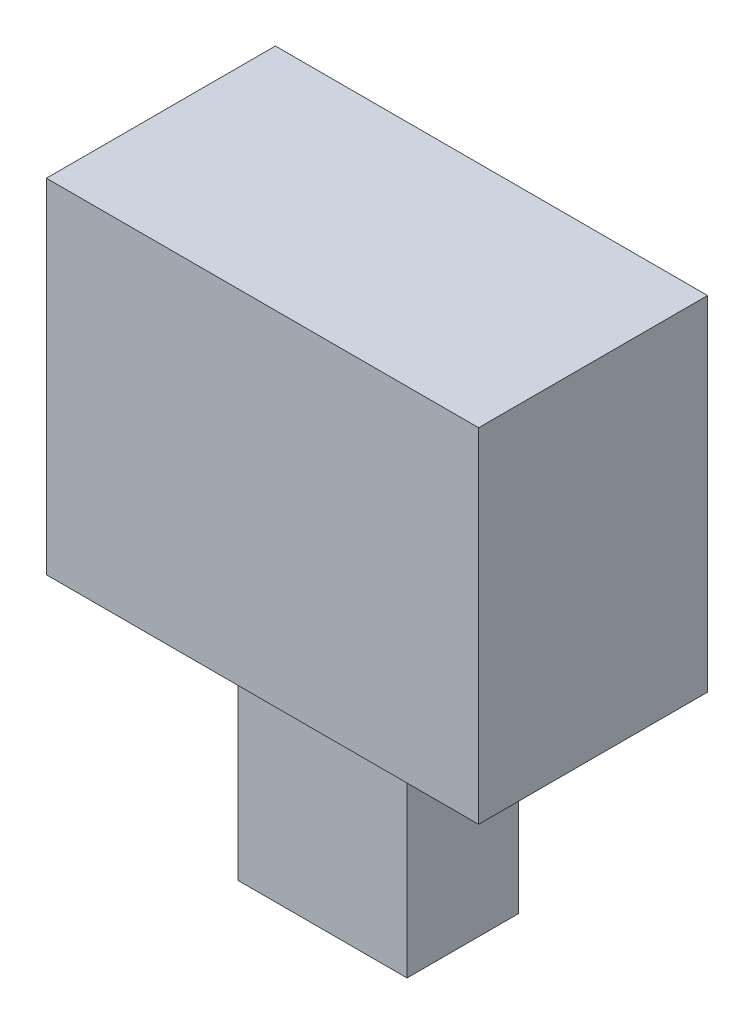
ISO-10303-21;
HEADER;
FILE_DESCRIPTION(('STEP AP214'),'2;1');
FILE_NAME('part.step','',(''),(''),'','','');
FILE_SCHEMA(('AUTOMOTIVE_DESIGN { 1 0 10303 214 1 1 1 1 }'));
ENDSEC;
DATA;
#1=APPLICATION_CONTEXT('core data for automotive mechanical design processes');
#2=APPLICATION_PROTOCOL_DEFINITION('international standard','automotive_design',2000,#1);
#3=PRODUCT_CONTEXT('',#1,'mechanical');
#4=PRODUCT('Part','Part','',(#3));
#5=PRODUCT_RELATED_PRODUCT_CATEGORY('part','',(#4));
#6=PRODUCT_DEFINITION_FORMATION('','',#4);
#7=PRODUCT_DEFINITION_CONTEXT('part definition',#1,'design');
#8=PRODUCT_DEFINITION('design','',#6,#7);
#9=PRODUCT_DEFINITION_SHAPE('','',#8);
#10=(LENGTH_UNIT() NAMED_UNIT(*) SI_UNIT(.MILLI.,.METRE.));
#11=(NAMED_UNIT(*) PLANE_ANGLE_UNIT() SI_UNIT($,.RADIAN.));
#12=(NAMED_UNIT(*) SI_UNIT($,.STERADIAN.) SOLID_ANGLE_UNIT());
#13=UNCERTAINTY_MEASURE_WITH_UNIT(LENGTH_MEASURE(1.E-05),#10,'distance_accuracy_value','');
#14=(GEOMETRIC_REPRESENTATION_CONTEXT(3) GLOBAL_UNCERTAINTY_ASSIGNED_CONTEXT((#13)) GLOBAL_UNIT_ASSIGNED_CONTEXT((#10,
#11,#12)) REPRESENTATION_CONTEXT('',''));
#15=CARTESIAN_POINT('',(0.,0.,0.));
#16=DIRECTION('',(0.,0.,1.));
#17=DIRECTION('',(1.,0.,0.));
#18=AXIS2_PLACEMENT_3D('',#15,#16,#17);
#19=CARTESIAN_POINT('',(-7.375,50.,5.));
#20=DIRECTION('',(0.,0.,-1.));
#21=DIRECTION('',(-1.,0.,0.));
#22=AXIS2_PLACEMENT_3D('',#19,#20,#21);
#23=PLANE('',#22);
#24=DIRECTION('',(1.,0.,0.));
#25=VECTOR('',#24,1.);
#26=CARTESIAN_POINT('',(-7.375,20.,5.));
#27=LINE('',#26,#25);
#28=CARTESIAN_POINT('',(-7.375,20.,5.));
#29=VERTEX_POINT('',#28);
#30=CARTESIAN_POINT('',(7.375,20.,5.));
#31=VERTEX_POINT('',#30);
#32=EDGE_CURVE('E169',#29,#31,#27,.T.);
#33=ORIENTED_EDGE('',*,*,#32,.F.);
#34=DIRECTION('',(0.,-1.,0.));
#35=VECTOR('',#34,1.);
#36=CARTESIAN_POINT('',(-7.375,50.,5.));
#37=LINE('',#36,#35);
#38=CARTESIAN_POINT('',(-7.375,0.,5.));
#39=VERTEX_POINT('',#38);
#40=EDGE_CURVE('E189',#29,#39,#37,.T.);
#41=ORIENTED_EDGE('',*,*,#40,.T.);
#42=DIRECTION('',(1.,0.,0.));
#43=VECTOR('',#42,1.);
#44=CARTESIAN_POINT('',(-7.375,0.,5.));
#45=LINE('',#44,#43);
#46=CARTESIAN_POINT('',(7.375,0.,5.));
#47=VERTEX_POINT('',#46);
#48=EDGE_CURVE('E173',#39,#47,#45,.T.);
#49=ORIENTED_EDGE('',*,*,#48,.T.);
#50=DIRECTION('',(0.,-1.,0.));
#51=VECTOR('',#50,1.);
#52=CARTESIAN_POINT('',(7.375,50.,5.));
#53=LINE('',#52,#51);
#54=EDGE_CURVE('E53',#31,#47,#53,.T.);
#55=ORIENTED_EDGE('',*,*,#54,.F.);
#56=EDGE_LOOP('',(#33,#41,#49,#55));
#57=FACE_BOUND('',#56,.T.);
#58=ADVANCED_FACE('F45',(#57),#23,.F.);
#59=CARTESIAN_POINT('',(7.375,50.,5.));
#60=DIRECTION('',(-1.,0.,0.));
#61=DIRECTION('',(0.,0.,1.));
#62=AXIS2_PLACEMENT_3D('',#59,#60,#61);
#63=PLANE('',#62);
#64=DIRECTION('',(0.,0.,-1.));
#65=VECTOR('',#64,1.);
#66=CARTESIAN_POINT('',(7.375,20.,5.));
#67=LINE('',#66,#65);
#68=CARTESIAN_POINT('',(7.375,20.,-4.75));
#69=VERTEX_POINT('',#68);
#70=EDGE_CURVE('E60',#31,#69,#67,.T.);
#71=ORIENTED_EDGE('',*,*,#70,.F.);
#72=ORIENTED_EDGE('',*,*,#54,.T.);
#73=DIRECTION('',(0.,0.,-1.));
#74=VECTOR('',#73,1.);
#75=CARTESIAN_POINT('',(7.375,0.,5.));
#76=LINE('',#75,#74);
#77=CARTESIAN_POINT('',(7.375,0.,-4.75));
#78=VERTEX_POINT('',#77);
#79=EDGE_CURVE('E177',#47,#78,#76,.T.);
#80=ORIENTED_EDGE('',*,*,#79,.T.);
#81=DIRECTION('',(0.,-1.,0.));
#82=VECTOR('',#81,1.);
#83=CARTESIAN_POINT('',(7.375,50.,-4.75));
#84=LINE('',#83,#82);
#85=EDGE_CURVE('E195',#69,#78,#84,.T.);
#86=ORIENTED_EDGE('',*,*,#85,.F.);
#87=EDGE_LOOP('',(#71,#72,#80,#86));
#88=FACE_BOUND('',#87,.T.);
#89=ADVANCED_FACE('F199',(#88),#63,.F.);
#90=CARTESIAN_POINT('',(7.375,50.,-4.75));
#91=DIRECTION('',(0.,0.,1.));
#92=DIRECTION('',(1.,0.,0.));
#93=AXIS2_PLACEMENT_3D('',#90,#91,#92);
#94=PLANE('',#93);
#95=DIRECTION('',(-1.,0.,0.));
#96=VECTOR('',#95,1.);
#97=CARTESIAN_POINT('',(7.375,20.,-4.75));
#98=LINE('',#97,#96);
#99=CARTESIAN_POINT('',(-7.375,20.,-4.75));
#100=VERTEX_POINT('',#99);
#101=EDGE_CURVE('E68',#69,#100,#98,.T.);
#102=ORIENTED_EDGE('',*,*,#101,.F.);
#103=ORIENTED_EDGE('',*,*,#85,.T.);
#104=DIRECTION('',(-1.,0.,0.));
#105=VECTOR('',#104,1.);
#106=CARTESIAN_POINT('',(7.375,0.,-4.75));
#107=LINE('',#106,#105);
#108=CARTESIAN_POINT('',(-7.375,0.,-4.75));
#109=VERTEX_POINT('',#108);
#110=EDGE_CURVE('E181',#78,#109,#107,.T.);
#111=ORIENTED_EDGE('',*,*,#110,.T.);
#112=DIRECTION('',(0.,-1.,0.));
#113=VECTOR('',#112,1.);
#114=CARTESIAN_POINT('',(-7.375,50.,-4.75));
#115=LINE('',#114,#113);
#116=EDGE_CURVE('E192',#100,#109,#115,.T.);
#117=ORIENTED_EDGE('',*,*,#116,.F.);
#118=EDGE_LOOP('',(#102,#103,#111,#117));
#119=FACE_BOUND('',#118,.T.);
#120=ADVANCED_FACE('F209',(#119),#94,.F.);
#121=CARTESIAN_POINT('',(-7.375,50.,-4.75));
#122=DIRECTION('',(1.,0.,0.));
#123=DIRECTION('',(0.,0.,-1.));
#124=AXIS2_PLACEMENT_3D('',#121,#122,#123);
#125=PLANE('',#124);
#126=DIRECTION('',(0.,0.,1.));
#127=VECTOR('',#126,1.);
#128=CARTESIAN_POINT('',(-7.375,20.,-4.75));
#129=LINE('',#128,#127);
#130=EDGE_CURVE('E11',#100,#29,#129,.T.);
#131=ORIENTED_EDGE('',*,*,#130,.F.);
#132=ORIENTED_EDGE('',*,*,#116,.T.);
#133=DIRECTION('',(0.,0.,1.));
#134=VECTOR('',#133,1.);
#135=CARTESIAN_POINT('',(-7.375,0.,-4.75));
#136=LINE('',#135,#134);
#137=EDGE_CURVE('E185',#109,#39,#136,.T.);
#138=ORIENTED_EDGE('',*,*,#137,.T.);
#139=ORIENTED_EDGE('',*,*,#40,.F.);
#140=EDGE_LOOP('',(#131,#132,#138,#139));
#141=FACE_BOUND('',#140,.T.);
#142=ADVANCED_FACE('F208',(#141),#125,.F.);
#143=CARTESIAN_POINT('',(0.,0.,0.));
#144=DIRECTION('',(0.,1.,0.));
#145=DIRECTION('',(0.,0.,1.));
#146=AXIS2_PLACEMENT_3D('',#143,#144,#145);
#147=PLANE('',#146);
#148=ORIENTED_EDGE('',*,*,#48,.F.);
#149=ORIENTED_EDGE('',*,*,#137,.F.);
#150=ORIENTED_EDGE('',*,*,#110,.F.);
#151=ORIENTED_EDGE('',*,*,#79,.F.);
#152=EDGE_LOOP('',(#148,#149,#150,#151));
#153=FACE_BOUND('',#152,.T.);
#154=ADVANCED_FACE('F205',(#153),#147,.F.);
#155=CARTESIAN_POINT('',(-18.875,20.,0.));
#156=DIRECTION('',(0.,1.,0.));
#157=DIRECTION('',(0.,0.,1.));
#158=AXIS2_PLACEMENT_3D('',#155,#156,#157);
#159=PLANE('',#158);
#160=DIRECTION('',(1.,0.,0.));
#161=VECTOR('',#160,1.);
#162=CARTESIAN_POINT('',(-18.875,20.,-9.75));
#163=LINE('',#162,#161);
#164=CARTESIAN_POINT('',(-18.875,20.,-9.75));
#165=VERTEX_POINT('',#164);
#166=CARTESIAN_POINT('',(18.875,20.,-9.75));
#167=VERTEX_POINT('',#166);
#168=EDGE_CURVE('E160',#165,#167,#163,.T.);
#169=ORIENTED_EDGE('',*,*,#168,.T.);
#170=DIRECTION('',(0.,0.,1.));
#171=VECTOR('',#170,1.);
#172=CARTESIAN_POINT('',(18.875,20.,0.));
#173=LINE('',#172,#171);
#174=CARTESIAN_POINT('',(18.875,20.,10.25));
#175=VERTEX_POINT('',#174);
#176=EDGE_CURVE('E133',#167,#175,#173,.T.);
#177=ORIENTED_EDGE('',*,*,#176,.T.);
#178=DIRECTION('',(1.,0.,0.));
#179=VECTOR('',#178,1.);
#180=CARTESIAN_POINT('',(-18.875,20.,10.25));
#181=LINE('',#180,#179);
#182=CARTESIAN_POINT('',(-18.875,20.,10.25));
#183=VERTEX_POINT('',#182);
#184=EDGE_CURVE('E122',#183,#175,#181,.T.);
#185=ORIENTED_EDGE('',*,*,#184,.F.);
#186=DIRECTION('',(0.,0.,1.));
#187=VECTOR('',#186,1.);
#188=CARTESIAN_POINT('',(-18.875,20.,0.));
#189=LINE('',#188,#187);
#190=EDGE_CURVE('E151',#165,#183,#189,.T.);
#191=ORIENTED_EDGE('',*,*,#190,.F.);
#192=EDGE_LOOP('',(#169,#177,#185,#191));
#193=FACE_BOUND('',#192,.T.);
#194=ORIENTED_EDGE('',*,*,#130,.T.);
#195=ORIENTED_EDGE('',*,*,#32,.T.);
#196=ORIENTED_EDGE('',*,*,#70,.T.);
#197=ORIENTED_EDGE('',*,*,#101,.T.);
#198=EDGE_LOOP('',(#194,#195,#196,#197));
#199=FACE_BOUND('',#198,.T.);
#200=ADVANCED_FACE('F211',(#193,#199),#159,.F.);
#201=CARTESIAN_POINT('',(-18.875,0.,-9.75));
#202=DIRECTION('',(0.,0.,-1.));
#203=DIRECTION('',(-1.,0.,0.));
#204=AXIS2_PLACEMENT_3D('',#201,#202,#203);
#205=PLANE('',#204);
#206=DIRECTION('',(1.,0.,0.));
#207=VECTOR('',#206,1.);
#208=CARTESIAN_POINT('',(-18.875,50.,-9.75));
#209=LINE('',#208,#207);
#210=CARTESIAN_POINT('',(-18.875,50.,-9.75));
#211=VERTEX_POINT('',#210);
#212=CARTESIAN_POINT('',(18.875,50.,-9.75));
#213=VERTEX_POINT('',#212);
#214=EDGE_CURVE('E157',#211,#213,#209,.T.);
#215=ORIENTED_EDGE('',*,*,#214,.T.);
#216=DIRECTION('',(0.,1.,0.));
#217=VECTOR('',#216,1.);
#218=CARTESIAN_POINT('',(18.875,0.,-9.75));
#219=LINE('',#218,#217);
#220=EDGE_CURVE('E138',#167,#213,#219,.T.);
#221=ORIENTED_EDGE('',*,*,#220,.F.);
#222=ORIENTED_EDGE('',*,*,#168,.F.);
#223=DIRECTION('',(0.,1.,0.));
#224=VECTOR('',#223,1.);
#225=CARTESIAN_POINT('',(-18.875,0.,-9.75));
#226=LINE('',#225,#224);
#227=EDGE_CURVE('E123',#165,#211,#226,.T.);
#228=ORIENTED_EDGE('',*,*,#227,.T.);
#229=EDGE_LOOP('',(#215,#221,#222,#228));
#230=FACE_BOUND('',#229,.T.);
#231=ADVANCED_FACE('F213',(#230),#205,.T.);
#232=CARTESIAN_POINT('',(-18.875,0.,10.25));
#233=DIRECTION('',(0.,0.,1.));
#234=DIRECTION('',(0.,-1.,0.));
#235=AXIS2_PLACEMENT_3D('',#232,#233,#234);
#236=PLANE('',#235);
#237=ORIENTED_EDGE('',*,*,#184,.T.);
#238=DIRECTION('',(0.,-1.,0.));
#239=VECTOR('',#238,1.);
#240=CARTESIAN_POINT('',(18.875,0.,10.25));
#241=LINE('',#240,#239);
#242=CARTESIAN_POINT('',(18.875,50.,10.25));
#243=VERTEX_POINT('',#242);
#244=EDGE_CURVE('E126',#243,#175,#241,.T.);
#245=ORIENTED_EDGE('',*,*,#244,.F.);
#246=DIRECTION('',(1.,0.,0.));
#247=VECTOR('',#246,1.);
#248=CARTESIAN_POINT('',(-18.875,50.,10.25));
#249=LINE('',#248,#247);
#250=CARTESIAN_POINT('',(-18.875,50.,10.25));
#251=VERTEX_POINT('',#250);
#252=EDGE_CURVE('E111',#251,#243,#249,.T.);
#253=ORIENTED_EDGE('',*,*,#252,.F.);
#254=DIRECTION('',(0.,-1.,0.));
#255=VECTOR('',#254,1.);
#256=CARTESIAN_POINT('',(-18.875,0.,10.25));
#257=LINE('',#256,#255);
#258=EDGE_CURVE('E148',#251,#183,#257,.T.);
#259=ORIENTED_EDGE('',*,*,#258,.T.);
#260=EDGE_LOOP('',(#237,#245,#253,#259));
#261=FACE_BOUND('',#260,.T.);
#262=ADVANCED_FACE('F127',(#261),#236,.T.);
#263=CARTESIAN_POINT('',(-18.875,0.,0.));
#264=DIRECTION('',(1.,0.,0.));
#265=DIRECTION('',(0.,0.,-1.));
#266=AXIS2_PLACEMENT_3D('',#263,#264,#265);
#267=PLANE('',#266);
#268=DIRECTION('',(0.,0.,-1.));
#269=VECTOR('',#268,1.);
#270=CARTESIAN_POINT('',(-18.875,50.,0.));
#271=LINE('',#270,#269);
#272=EDGE_CURVE('E117',#251,#211,#271,.T.);
#273=ORIENTED_EDGE('',*,*,#272,.T.);
#274=ORIENTED_EDGE('',*,*,#227,.F.);
#275=ORIENTED_EDGE('',*,*,#190,.T.);
#276=ORIENTED_EDGE('',*,*,#258,.F.);
#277=EDGE_LOOP('',(#273,#274,#275,#276));
#278=FACE_BOUND('',#277,.T.);
#279=ADVANCED_FACE('F237',(#278),#267,.F.);
#280=CARTESIAN_POINT('',(18.875,0.,0.));
#281=DIRECTION('',(1.,0.,0.));
#282=DIRECTION('',(0.,0.,-1.));
#283=AXIS2_PLACEMENT_3D('',#280,#281,#282);
#284=PLANE('',#283);
#285=DIRECTION('',(0.,0.,-1.));
#286=VECTOR('',#285,1.);
#287=CARTESIAN_POINT('',(18.875,50.,0.));
#288=LINE('',#287,#286);
#289=EDGE_CURVE('E116',#243,#213,#288,.T.);
#290=ORIENTED_EDGE('',*,*,#289,.F.);
#291=ORIENTED_EDGE('',*,*,#244,.T.);
#292=ORIENTED_EDGE('',*,*,#176,.F.);
#293=ORIENTED_EDGE('',*,*,#220,.T.);
#294=EDGE_LOOP('',(#290,#291,#292,#293));
#295=FACE_BOUND('',#294,.T.);
#296=ADVANCED_FACE('F136',(#295),#284,.T.);
#297=CARTESIAN_POINT('',(0.,50.,0.));
#298=DIRECTION('',(0.,1.,0.));
#299=DIRECTION('',(0.,0.,1.));
#300=AXIS2_PLACEMENT_3D('',#297,#298,#299);
#301=PLANE('',#300);
#302=ORIENTED_EDGE('',*,*,#252,.T.);
#303=ORIENTED_EDGE('',*,*,#289,.T.);
#304=ORIENTED_EDGE('',*,*,#214,.F.);
#305=ORIENTED_EDGE('',*,*,#272,.F.);
#306=EDGE_LOOP('',(#302,#303,#304,#305));
#307=FACE_BOUND('',#306,.T.);
#308=ADVANCED_FACE('F113',(#307),#301,.T.);
#309=CLOSED_SHELL('',(#58,#89,#120,#142,#154,#200,#231,#262,#279,#296,#308));
#310=MANIFOLD_SOLID_BREP('B2',#309);
#311=ADVANCED_BREP_SHAPE_REPRESENTATION('',(#18,#310),#14);
#312=SHAPE_DEFINITION_REPRESENTATION(#9,#311);
ENDSEC;
END-ISO-10303-21;
